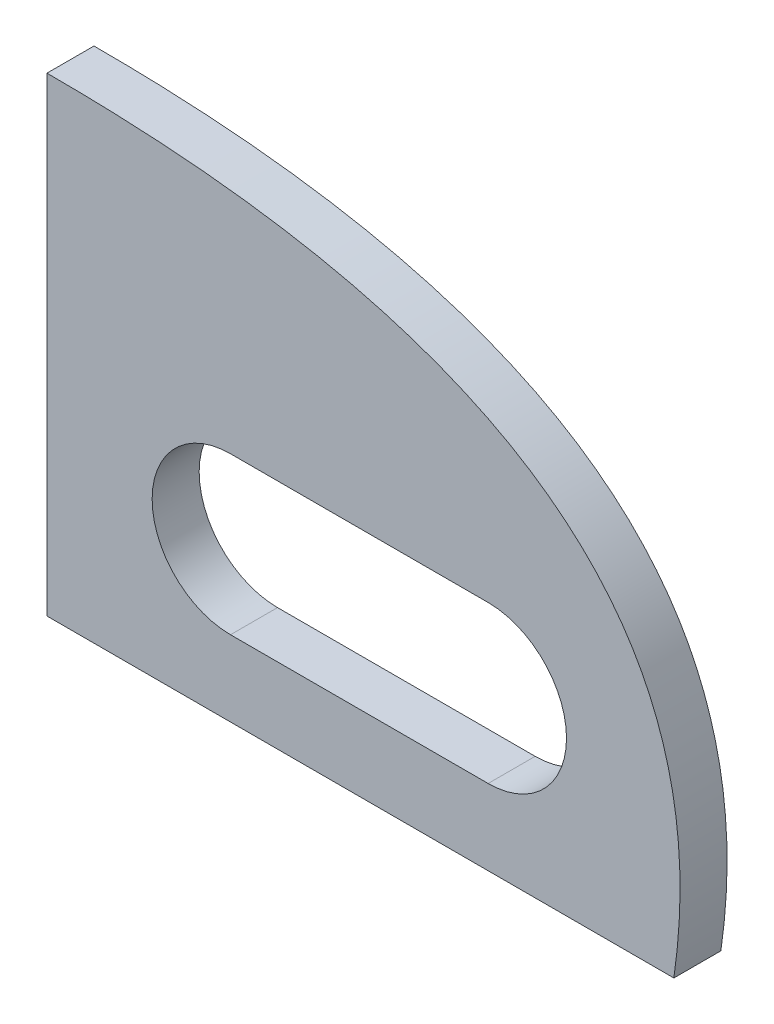
ISO-10303-21;
HEADER;
FILE_DESCRIPTION(('STEP AP214'),'2;1');
FILE_NAME('part.step','',(''),(''),'','','');
FILE_SCHEMA(('AUTOMOTIVE_DESIGN { 1 0 10303 214 1 1 1 1 }'));
ENDSEC;
DATA;
#1=APPLICATION_CONTEXT('core data for automotive mechanical design processes');
#2=APPLICATION_PROTOCOL_DEFINITION('international standard','automotive_design',2000,#1);
#3=PRODUCT_CONTEXT('',#1,'mechanical');
#4=PRODUCT('Part','Part','',(#3));
#5=PRODUCT_RELATED_PRODUCT_CATEGORY('part','',(#4));
#6=PRODUCT_DEFINITION_FORMATION('','',#4);
#7=PRODUCT_DEFINITION_CONTEXT('part definition',#1,'design');
#8=PRODUCT_DEFINITION('design','',#6,#7);
#9=PRODUCT_DEFINITION_SHAPE('','',#8);
#10=(LENGTH_UNIT() NAMED_UNIT(*) SI_UNIT(.MILLI.,.METRE.));
#11=(NAMED_UNIT(*) PLANE_ANGLE_UNIT() SI_UNIT($,.RADIAN.));
#12=(NAMED_UNIT(*) SI_UNIT($,.STERADIAN.) SOLID_ANGLE_UNIT());
#13=UNCERTAINTY_MEASURE_WITH_UNIT(LENGTH_MEASURE(1.E-05),#10,'distance_accuracy_value','');
#14=(GEOMETRIC_REPRESENTATION_CONTEXT(3) GLOBAL_UNCERTAINTY_ASSIGNED_CONTEXT((#13)) GLOBAL_UNIT_ASSIGNED_CONTEXT((#10,
#11,#12)) REPRESENTATION_CONTEXT('',''));
#15=CARTESIAN_POINT('',(0.,0.,0.));
#16=DIRECTION('',(0.,0.,1.));
#17=DIRECTION('',(1.,0.,0.));
#18=AXIS2_PLACEMENT_3D('',#15,#16,#17);
#19=CARTESIAN_POINT('',(32.1927331593654,22.5058787754595,3.));
#20=DIRECTION('',(0.,0.,1.));
#21=DIRECTION('',(1.,0.,0.));
#22=AXIS2_PLACEMENT_3D('',#19,#20,#21);
#23=PLANE('',#22);
#24=DIRECTION('',(1.,0.,0.));
#25=VECTOR('',#24,1.);
#26=CARTESIAN_POINT('',(0.,0.,3.));
#27=LINE('',#26,#25);
#28=CARTESIAN_POINT('',(0.,0.,3.));
#29=VERTEX_POINT('',#28);
#30=CARTESIAN_POINT('',(40.,0.,3.));
#31=VERTEX_POINT('',#30);
#32=EDGE_CURVE('E128',#29,#31,#27,.T.);
#33=ORIENTED_EDGE('',*,*,#32,.T.);
#34=CARTESIAN_POINT('',(40.,0.,3.));
#35=CARTESIAN_POINT('',(44.3854663187308,30.0117575509191,3.));
#36=CARTESIAN_POINT('',(0.,30.,3.));
#37=B_SPLINE_CURVE_WITH_KNOTS('',2,(#34,#35,#36),.UNSPECIFIED.,.F.,.F.,(3,3),(0.,1.),.UNSPECIFIED.);
#38=CARTESIAN_POINT('',(0.,30.,3.));
#39=VERTEX_POINT('',#38);
#40=EDGE_CURVE('E131',#31,#39,#37,.T.);
#41=ORIENTED_EDGE('',*,*,#40,.T.);
#42=DIRECTION('',(0.,-1.,0.));
#43=VECTOR('',#42,1.);
#44=CARTESIAN_POINT('',(0.,30.,3.));
#45=LINE('',#44,#43);
#46=EDGE_CURVE('E137',#39,#29,#45,.T.);
#47=ORIENTED_EDGE('',*,*,#46,.T.);
#48=EDGE_LOOP('',(#33,#41,#47));
#49=FACE_BOUND('',#48,.T.);
#50=DIRECTION('',(1.,0.,0.));
#51=VECTOR('',#50,1.);
#52=CARTESIAN_POINT('',(11.7108317167348,4.82356346775037,3.));
#53=LINE('',#52,#51);
#54=CARTESIAN_POINT('',(11.7108317167348,4.82356346775037,3.));
#55=VERTEX_POINT('',#54);
#56=CARTESIAN_POINT('',(28.1496370620346,4.82356346775037,3.));
#57=VERTEX_POINT('',#56);
#58=EDGE_CURVE('E100',#55,#57,#53,.T.);
#59=ORIENTED_EDGE('',*,*,#58,.F.);
#60=CARTESIAN_POINT('',(11.7108317167348,9.82356346775037,3.));
#61=DIRECTION('',(0.,0.,1.));
#62=DIRECTION('',(1.,0.,0.));
#63=AXIS2_PLACEMENT_3D('',#60,#61,#62);
#64=CIRCLE('',#63,5.);
#65=CARTESIAN_POINT('',(11.7108317167348,14.8235634677504,3.));
#66=VERTEX_POINT('',#65);
#67=EDGE_CURVE('E92',#66,#55,#64,.T.);
#68=ORIENTED_EDGE('',*,*,#67,.F.);
#69=DIRECTION('',(-1.,0.,0.));
#70=VECTOR('',#69,1.);
#71=CARTESIAN_POINT('',(11.7108317167348,14.8235634677504,3.));
#72=LINE('',#71,#70);
#73=CARTESIAN_POINT('',(28.1496370620346,14.8235634677504,3.));
#74=VERTEX_POINT('',#73);
#75=EDGE_CURVE('E114',#74,#66,#72,.T.);
#76=ORIENTED_EDGE('',*,*,#75,.F.);
#77=CARTESIAN_POINT('',(28.1496370620346,9.82356346775037,3.));
#78=DIRECTION('',(0.,0.,1.));
#79=DIRECTION('',(1.,0.,0.));
#80=AXIS2_PLACEMENT_3D('',#77,#78,#79);
#81=CIRCLE('',#80,5.);
#82=EDGE_CURVE('E112',#57,#74,#81,.T.);
#83=ORIENTED_EDGE('',*,*,#82,.F.);
#84=EDGE_LOOP('',(#59,#68,#76,#83));
#85=FACE_BOUND('',#84,.T.);
#86=ADVANCED_FACE('F33',(#49,#85),#23,.T.);
#87=CARTESIAN_POINT('',(32.1927331593654,22.5058787754595,0.));
#88=DIRECTION('',(0.,0.,1.));
#89=DIRECTION('',(1.,0.,0.));
#90=AXIS2_PLACEMENT_3D('',#87,#88,#89);
#91=PLANE('',#90);
#92=DIRECTION('',(1.,0.,0.));
#93=VECTOR('',#92,1.);
#94=CARTESIAN_POINT('',(0.,0.,0.));
#95=LINE('',#94,#93);
#96=CARTESIAN_POINT('',(0.,0.,0.));
#97=VERTEX_POINT('',#96);
#98=CARTESIAN_POINT('',(40.,0.,0.));
#99=VERTEX_POINT('',#98);
#100=EDGE_CURVE('E108',#97,#99,#95,.T.);
#101=ORIENTED_EDGE('',*,*,#100,.F.);
#102=DIRECTION('',(0.,-1.,0.));
#103=VECTOR('',#102,1.);
#104=CARTESIAN_POINT('',(0.,30.,0.));
#105=LINE('',#104,#103);
#106=CARTESIAN_POINT('',(0.,30.,0.));
#107=VERTEX_POINT('',#106);
#108=EDGE_CURVE('E132',#107,#97,#105,.T.);
#109=ORIENTED_EDGE('',*,*,#108,.F.);
#110=CARTESIAN_POINT('',(40.,0.,0.));
#111=CARTESIAN_POINT('',(44.3854663187308,30.0117575509191,0.));
#112=CARTESIAN_POINT('',(0.,30.,0.));
#113=B_SPLINE_CURVE_WITH_KNOTS('',2,(#110,#111,#112),.UNSPECIFIED.,.F.,.F.,(3,3),(0.,1.),.UNSPECIFIED.);
#114=EDGE_CURVE('E233',#99,#107,#113,.T.);
#115=ORIENTED_EDGE('',*,*,#114,.F.);
#116=EDGE_LOOP('',(#101,#109,#115));
#117=FACE_BOUND('',#116,.T.);
#118=CARTESIAN_POINT('',(11.7108317167348,9.82356346775037,0.));
#119=DIRECTION('',(0.,0.,1.));
#120=DIRECTION('',(1.,0.,0.));
#121=AXIS2_PLACEMENT_3D('',#118,#119,#120);
#122=CIRCLE('',#121,5.);
#123=CARTESIAN_POINT('',(11.7108317167348,14.8235634677504,0.));
#124=VERTEX_POINT('',#123);
#125=CARTESIAN_POINT('',(11.7108317167348,4.82356346775037,0.));
#126=VERTEX_POINT('',#125);
#127=EDGE_CURVE('E56',#124,#126,#122,.T.);
#128=ORIENTED_EDGE('',*,*,#127,.T.);
#129=DIRECTION('',(1.,0.,0.));
#130=VECTOR('',#129,1.);
#131=CARTESIAN_POINT('',(11.7108317167348,4.82356346775037,0.));
#132=LINE('',#131,#130);
#133=CARTESIAN_POINT('',(28.1496370620346,4.82356346775037,0.));
#134=VERTEX_POINT('',#133);
#135=EDGE_CURVE('E107',#126,#134,#132,.T.);
#136=ORIENTED_EDGE('',*,*,#135,.T.);
#137=CARTESIAN_POINT('',(28.1496370620346,9.82356346775037,0.));
#138=DIRECTION('',(0.,0.,1.));
#139=DIRECTION('',(1.,0.,0.));
#140=AXIS2_PLACEMENT_3D('',#137,#138,#139);
#141=CIRCLE('',#140,5.);
#142=CARTESIAN_POINT('',(28.1496370620346,14.8235634677504,0.));
#143=VERTEX_POINT('',#142);
#144=EDGE_CURVE('E120',#134,#143,#141,.T.);
#145=ORIENTED_EDGE('',*,*,#144,.T.);
#146=DIRECTION('',(-1.,0.,0.));
#147=VECTOR('',#146,1.);
#148=CARTESIAN_POINT('',(11.7108317167348,14.8235634677504,0.));
#149=LINE('',#148,#147);
#150=EDGE_CURVE('E101',#143,#124,#149,.T.);
#151=ORIENTED_EDGE('',*,*,#150,.T.);
#152=EDGE_LOOP('',(#128,#136,#145,#151));
#153=FACE_BOUND('',#152,.T.);
#154=ADVANCED_FACE('F150',(#117,#153),#91,.F.);
#155=CARTESIAN_POINT('',(0.,0.,3.));
#156=DIRECTION('',(0.,1.,0.));
#157=DIRECTION('',(-1.,0.,0.));
#158=AXIS2_PLACEMENT_3D('',#155,#156,#157);
#159=PLANE('',#158);
#160=ORIENTED_EDGE('',*,*,#100,.T.);
#161=DIRECTION('',(0.,0.,-1.));
#162=VECTOR('',#161,1.);
#163=CARTESIAN_POINT('',(40.,0.,3.));
#164=LINE('',#163,#162);
#165=EDGE_CURVE('E11',#31,#99,#164,.T.);
#166=ORIENTED_EDGE('',*,*,#165,.F.);
#167=ORIENTED_EDGE('',*,*,#32,.F.);
#168=DIRECTION('',(0.,0.,-1.));
#169=VECTOR('',#168,1.);
#170=CARTESIAN_POINT('',(0.,0.,3.));
#171=LINE('',#170,#169);
#172=EDGE_CURVE('E231',#29,#97,#171,.T.);
#173=ORIENTED_EDGE('',*,*,#172,.T.);
#174=EDGE_LOOP('',(#160,#166,#167,#173));
#175=FACE_BOUND('',#174,.T.);
#176=ADVANCED_FACE('F35',(#175),#159,.F.);
#177=DIRECTION('',(0.,0.,-1.));
#178=VECTOR('',#177,1.);
#179=SURFACE_OF_LINEAR_EXTRUSION('',#37,#178);
#180=ORIENTED_EDGE('',*,*,#114,.T.);
#181=DIRECTION('',(0.,0.,-1.));
#182=VECTOR('',#181,1.);
#183=CARTESIAN_POINT('',(0.,30.,3.));
#184=LINE('',#183,#182);
#185=EDGE_CURVE('E41',#39,#107,#184,.T.);
#186=ORIENTED_EDGE('',*,*,#185,.F.);
#187=ORIENTED_EDGE('',*,*,#40,.F.);
#188=ORIENTED_EDGE('',*,*,#165,.T.);
#189=EDGE_LOOP('',(#180,#186,#187,#188));
#190=FACE_BOUND('',#189,.T.);
#191=ADVANCED_FACE('F142',(#190),#179,.F.);
#192=CARTESIAN_POINT('',(0.,30.,3.));
#193=DIRECTION('',(1.,0.,0.));
#194=DIRECTION('',(0.,1.,0.));
#195=AXIS2_PLACEMENT_3D('',#192,#193,#194);
#196=PLANE('',#195);
#197=ORIENTED_EDGE('',*,*,#108,.T.);
#198=ORIENTED_EDGE('',*,*,#172,.F.);
#199=ORIENTED_EDGE('',*,*,#46,.F.);
#200=ORIENTED_EDGE('',*,*,#185,.T.);
#201=EDGE_LOOP('',(#197,#198,#199,#200));
#202=FACE_BOUND('',#201,.T.);
#203=ADVANCED_FACE('F145',(#202),#196,.F.);
#204=CARTESIAN_POINT('',(11.7108317167348,9.82356346775037,3.));
#205=DIRECTION('',(0.,0.,-1.));
#206=DIRECTION('',(-1.,0.,0.));
#207=AXIS2_PLACEMENT_3D('',#204,#205,#206);
#208=CYLINDRICAL_SURFACE('',#207,5.);
#209=ORIENTED_EDGE('',*,*,#127,.F.);
#210=DIRECTION('',(0.,0.,-1.));
#211=VECTOR('',#210,1.);
#212=CARTESIAN_POINT('',(11.7108317167348,14.8235634677504,3.));
#213=LINE('',#212,#211);
#214=EDGE_CURVE('E96',#66,#124,#213,.T.);
#215=ORIENTED_EDGE('',*,*,#214,.F.);
#216=ORIENTED_EDGE('',*,*,#67,.T.);
#217=DIRECTION('',(0.,0.,-1.));
#218=VECTOR('',#217,1.);
#219=CARTESIAN_POINT('',(11.7108317167348,4.82356346775037,3.));
#220=LINE('',#219,#218);
#221=EDGE_CURVE('E95',#55,#126,#220,.T.);
#222=ORIENTED_EDGE('',*,*,#221,.T.);
#223=EDGE_LOOP('',(#209,#215,#216,#222));
#224=FACE_BOUND('',#223,.T.);
#225=ADVANCED_FACE('F94',(#224),#208,.F.);
#226=CARTESIAN_POINT('',(11.7108317167348,4.82356346775037,3.));
#227=DIRECTION('',(0.,1.,0.));
#228=DIRECTION('',(-1.,0.,0.));
#229=AXIS2_PLACEMENT_3D('',#226,#227,#228);
#230=PLANE('',#229);
#231=ORIENTED_EDGE('',*,*,#135,.F.);
#232=ORIENTED_EDGE('',*,*,#221,.F.);
#233=ORIENTED_EDGE('',*,*,#58,.T.);
#234=DIRECTION('',(0.,0.,-1.));
#235=VECTOR('',#234,1.);
#236=CARTESIAN_POINT('',(28.1496370620346,4.82356346775037,3.));
#237=LINE('',#236,#235);
#238=EDGE_CURVE('E109',#57,#134,#237,.T.);
#239=ORIENTED_EDGE('',*,*,#238,.T.);
#240=EDGE_LOOP('',(#231,#232,#233,#239));
#241=FACE_BOUND('',#240,.T.);
#242=ADVANCED_FACE('F104',(#241),#230,.T.);
#243=CARTESIAN_POINT('',(28.1496370620346,9.82356346775037,3.));
#244=DIRECTION('',(0.,0.,-1.));
#245=DIRECTION('',(-1.,0.,0.));
#246=AXIS2_PLACEMENT_3D('',#243,#244,#245);
#247=CYLINDRICAL_SURFACE('',#246,5.);
#248=ORIENTED_EDGE('',*,*,#144,.F.);
#249=ORIENTED_EDGE('',*,*,#238,.F.);
#250=ORIENTED_EDGE('',*,*,#82,.T.);
#251=DIRECTION('',(0.,0.,-1.));
#252=VECTOR('',#251,1.);
#253=CARTESIAN_POINT('',(28.1496370620346,14.8235634677504,3.));
#254=LINE('',#253,#252);
#255=EDGE_CURVE('E48',#74,#143,#254,.T.);
#256=ORIENTED_EDGE('',*,*,#255,.T.);
#257=EDGE_LOOP('',(#248,#249,#250,#256));
#258=FACE_BOUND('',#257,.T.);
#259=ADVANCED_FACE('F161',(#258),#247,.F.);
#260=CARTESIAN_POINT('',(11.7108317167348,14.8235634677504,3.));
#261=DIRECTION('',(0.,-1.,0.));
#262=DIRECTION('',(1.,0.,0.));
#263=AXIS2_PLACEMENT_3D('',#260,#261,#262);
#264=PLANE('',#263);
#265=ORIENTED_EDGE('',*,*,#150,.F.);
#266=ORIENTED_EDGE('',*,*,#255,.F.);
#267=ORIENTED_EDGE('',*,*,#75,.T.);
#268=ORIENTED_EDGE('',*,*,#214,.T.);
#269=EDGE_LOOP('',(#265,#266,#267,#268));
#270=FACE_BOUND('',#269,.T.);
#271=ADVANCED_FACE('F164',(#270),#264,.T.);
#272=CLOSED_SHELL('',(#86,#154,#176,#191,#203,#225,#242,#259,#271));
#273=MANIFOLD_SOLID_BREP('B2',#272);
#274=ADVANCED_BREP_SHAPE_REPRESENTATION('',(#18,#273),#14);
#275=SHAPE_DEFINITION_REPRESENTATION(#9,#274);
ENDSEC;
END-ISO-10303-21;
